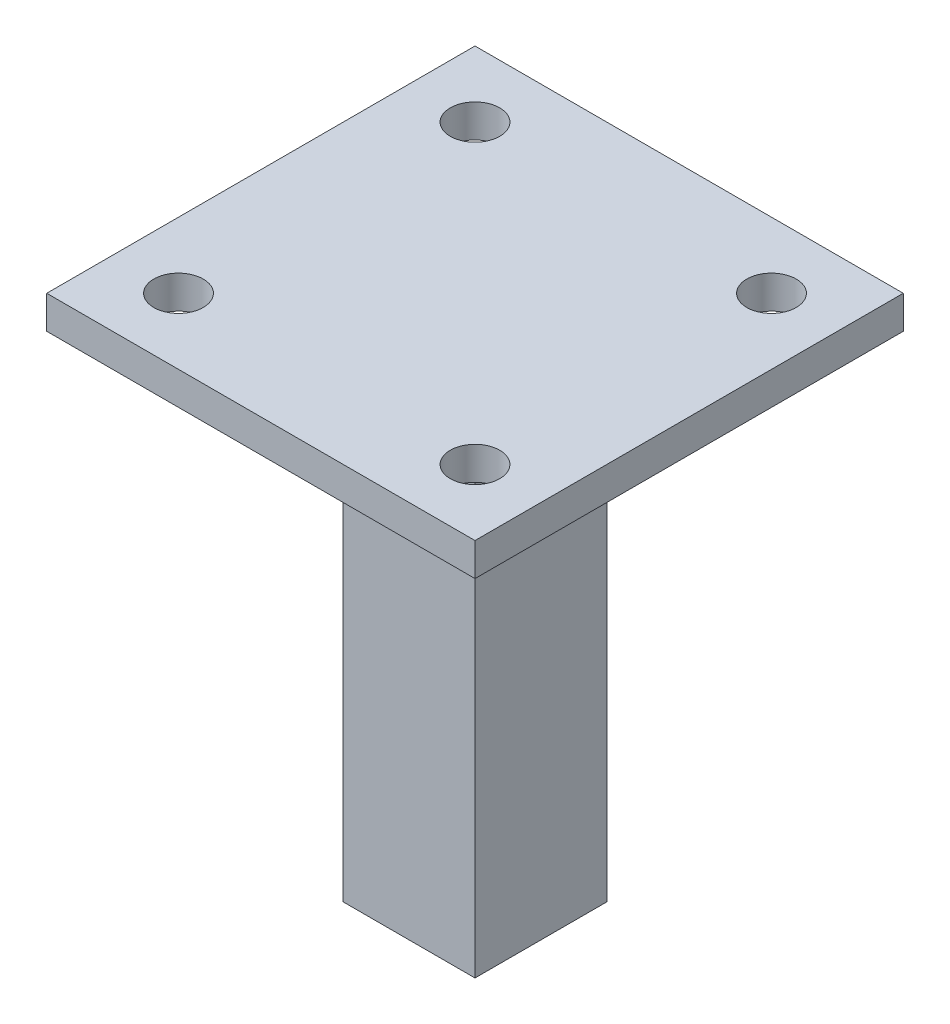
ISO-10303-21;
HEADER;
FILE_DESCRIPTION(('STEP AP214'),'2;1');
FILE_NAME('part.step','',(''),(''),'','','');
FILE_SCHEMA(('AUTOMOTIVE_DESIGN { 1 0 10303 214 1 1 1 1 }'));
ENDSEC;
DATA;
#1=APPLICATION_CONTEXT('core data for automotive mechanical design processes');
#2=APPLICATION_PROTOCOL_DEFINITION('international standard','automotive_design',2000,#1);
#3=PRODUCT_CONTEXT('',#1,'mechanical');
#4=PRODUCT('Part','Part','',(#3));
#5=PRODUCT_RELATED_PRODUCT_CATEGORY('part','',(#4));
#6=PRODUCT_DEFINITION_FORMATION('','',#4);
#7=PRODUCT_DEFINITION_CONTEXT('part definition',#1,'design');
#8=PRODUCT_DEFINITION('design','',#6,#7);
#9=PRODUCT_DEFINITION_SHAPE('','',#8);
#10=(LENGTH_UNIT() NAMED_UNIT(*) SI_UNIT(.MILLI.,.METRE.));
#11=(NAMED_UNIT(*) PLANE_ANGLE_UNIT() SI_UNIT($,.RADIAN.));
#12=(NAMED_UNIT(*) SI_UNIT($,.STERADIAN.) SOLID_ANGLE_UNIT());
#13=UNCERTAINTY_MEASURE_WITH_UNIT(LENGTH_MEASURE(1.E-05),#10,'distance_accuracy_value','');
#14=(GEOMETRIC_REPRESENTATION_CONTEXT(3) GLOBAL_UNCERTAINTY_ASSIGNED_CONTEXT((#13)) GLOBAL_UNIT_ASSIGNED_CONTEXT((#10,
#11,#12)) REPRESENTATION_CONTEXT('',''));
#15=CARTESIAN_POINT('',(0.,0.,0.));
#16=DIRECTION('',(0.,0.,1.));
#17=DIRECTION('',(1.,0.,0.));
#18=AXIS2_PLACEMENT_3D('',#15,#16,#17);
#19=CARTESIAN_POINT('',(20.,150.,20.));
#20=DIRECTION('',(-1.,0.,0.));
#21=DIRECTION('',(0.,0.,1.));
#22=AXIS2_PLACEMENT_3D('',#19,#20,#21);
#23=PLANE('',#22);
#24=DIRECTION('',(0.,0.,-1.));
#25=VECTOR('',#24,1.);
#26=CARTESIAN_POINT('',(20.,0.,20.));
#27=LINE('',#26,#25);
#28=CARTESIAN_POINT('',(20.,0.,20.));
#29=VERTEX_POINT('',#28);
#30=CARTESIAN_POINT('',(20.,0.,-20.));
#31=VERTEX_POINT('',#30);
#32=EDGE_CURVE('E135',#29,#31,#27,.T.);
#33=ORIENTED_EDGE('',*,*,#32,.T.);
#34=DIRECTION('',(0.,-1.,0.));
#35=VECTOR('',#34,1.);
#36=CARTESIAN_POINT('',(20.,150.,-20.));
#37=LINE('',#36,#35);
#38=CARTESIAN_POINT('',(20.,150.,-20.));
#39=VERTEX_POINT('',#38);
#40=EDGE_CURVE('E11',#39,#31,#37,.T.);
#41=ORIENTED_EDGE('',*,*,#40,.F.);
#42=DIRECTION('',(0.,0.,-1.));
#43=VECTOR('',#42,1.);
#44=CARTESIAN_POINT('',(20.,150.,20.));
#45=LINE('',#44,#43);
#46=CARTESIAN_POINT('',(20.,150.,20.));
#47=VERTEX_POINT('',#46);
#48=EDGE_CURVE('E144',#47,#39,#45,.T.);
#49=ORIENTED_EDGE('',*,*,#48,.F.);
#50=DIRECTION('',(0.,-1.,0.));
#51=VECTOR('',#50,1.);
#52=CARTESIAN_POINT('',(20.,150.,20.));
#53=LINE('',#52,#51);
#54=EDGE_CURVE('E153',#47,#29,#53,.T.);
#55=ORIENTED_EDGE('',*,*,#54,.T.);
#56=EDGE_LOOP('',(#33,#41,#49,#55));
#57=FACE_BOUND('',#56,.T.);
#58=ADVANCED_FACE('F36',(#57),#23,.F.);
#59=CARTESIAN_POINT('',(-20.,150.,-20.));
#60=DIRECTION('',(0.,0.,1.));
#61=DIRECTION('',(1.,0.,0.));
#62=AXIS2_PLACEMENT_3D('',#59,#60,#61);
#63=PLANE('',#62);
#64=DIRECTION('',(-1.,0.,0.));
#65=VECTOR('',#64,1.);
#66=CARTESIAN_POINT('',(-20.,0.,-20.));
#67=LINE('',#66,#65);
#68=CARTESIAN_POINT('',(-20.,0.,-20.));
#69=VERTEX_POINT('',#68);
#70=EDGE_CURVE('E138',#31,#69,#67,.T.);
#71=ORIENTED_EDGE('',*,*,#70,.T.);
#72=DIRECTION('',(0.,-1.,0.));
#73=VECTOR('',#72,1.);
#74=CARTESIAN_POINT('',(-20.,150.,-20.));
#75=LINE('',#74,#73);
#76=CARTESIAN_POINT('',(-20.,150.,-20.));
#77=VERTEX_POINT('',#76);
#78=EDGE_CURVE('E44',#77,#69,#75,.T.);
#79=ORIENTED_EDGE('',*,*,#78,.F.);
#80=DIRECTION('',(-1.,0.,0.));
#81=VECTOR('',#80,1.);
#82=CARTESIAN_POINT('',(-20.,150.,-20.));
#83=LINE('',#82,#81);
#84=EDGE_CURVE('E78',#39,#77,#83,.T.);
#85=ORIENTED_EDGE('',*,*,#84,.F.);
#86=ORIENTED_EDGE('',*,*,#40,.T.);
#87=EDGE_LOOP('',(#71,#79,#85,#86));
#88=FACE_BOUND('',#87,.T.);
#89=ADVANCED_FACE('F231',(#88),#63,.F.);
#90=CARTESIAN_POINT('',(-20.,150.,20.));
#91=DIRECTION('',(1.,0.,0.));
#92=DIRECTION('',(0.,0.,-1.));
#93=AXIS2_PLACEMENT_3D('',#90,#91,#92);
#94=PLANE('',#93);
#95=DIRECTION('',(0.,0.,1.));
#96=VECTOR('',#95,1.);
#97=CARTESIAN_POINT('',(-20.,0.,20.));
#98=LINE('',#97,#96);
#99=CARTESIAN_POINT('',(-20.,0.,20.));
#100=VERTEX_POINT('',#99);
#101=EDGE_CURVE('E68',#69,#100,#98,.T.);
#102=ORIENTED_EDGE('',*,*,#101,.T.);
#103=DIRECTION('',(0.,-1.,0.));
#104=VECTOR('',#103,1.);
#105=CARTESIAN_POINT('',(-20.,150.,20.));
#106=LINE('',#105,#104);
#107=CARTESIAN_POINT('',(-20.,150.,20.));
#108=VERTEX_POINT('',#107);
#109=EDGE_CURVE('E52',#108,#100,#106,.T.);
#110=ORIENTED_EDGE('',*,*,#109,.F.);
#111=DIRECTION('',(0.,0.,1.));
#112=VECTOR('',#111,1.);
#113=CARTESIAN_POINT('',(-20.,150.,20.));
#114=LINE('',#113,#112);
#115=EDGE_CURVE('E148',#77,#108,#114,.T.);
#116=ORIENTED_EDGE('',*,*,#115,.F.);
#117=ORIENTED_EDGE('',*,*,#78,.T.);
#118=EDGE_LOOP('',(#102,#110,#116,#117));
#119=FACE_BOUND('',#118,.T.);
#120=ADVANCED_FACE('F159',(#119),#94,.F.);
#121=CARTESIAN_POINT('',(-20.,150.,20.));
#122=DIRECTION('',(0.,0.,-1.));
#123=DIRECTION('',(-1.,0.,0.));
#124=AXIS2_PLACEMENT_3D('',#121,#122,#123);
#125=PLANE('',#124);
#126=DIRECTION('',(1.,0.,0.));
#127=VECTOR('',#126,1.);
#128=CARTESIAN_POINT('',(-20.,0.,20.));
#129=LINE('',#128,#127);
#130=EDGE_CURVE('E73',#100,#29,#129,.T.);
#131=ORIENTED_EDGE('',*,*,#130,.T.);
#132=ORIENTED_EDGE('',*,*,#54,.F.);
#133=DIRECTION('',(1.,0.,0.));
#134=VECTOR('',#133,1.);
#135=CARTESIAN_POINT('',(-20.,150.,20.));
#136=LINE('',#135,#134);
#137=EDGE_CURVE('E151',#108,#47,#136,.T.);
#138=ORIENTED_EDGE('',*,*,#137,.F.);
#139=ORIENTED_EDGE('',*,*,#109,.T.);
#140=EDGE_LOOP('',(#131,#132,#138,#139));
#141=FACE_BOUND('',#140,.T.);
#142=ADVANCED_FACE('F164',(#141),#125,.F.);
#143=CARTESIAN_POINT('',(0.,0.,0.));
#144=DIRECTION('',(0.,-1.,0.));
#145=DIRECTION('',(0.,0.,-1.));
#146=AXIS2_PLACEMENT_3D('',#143,#144,#145);
#147=PLANE('',#146);
#148=ORIENTED_EDGE('',*,*,#32,.F.);
#149=ORIENTED_EDGE('',*,*,#130,.F.);
#150=ORIENTED_EDGE('',*,*,#101,.F.);
#151=ORIENTED_EDGE('',*,*,#70,.F.);
#152=EDGE_LOOP('',(#148,#149,#150,#151));
#153=FACE_BOUND('',#152,.T.);
#154=ADVANCED_FACE('F162',(#153),#147,.T.);
#155=CARTESIAN_POINT('',(0.,160.,0.));
#156=DIRECTION('',(0.,-1.,0.));
#157=DIRECTION('',(0.,0.,-1.));
#158=AXIS2_PLACEMENT_3D('',#155,#156,#157);
#159=PLANE('',#158);
#160=DIRECTION('',(0.,0.,-1.));
#161=VECTOR('',#160,1.);
#162=CARTESIAN_POINT('',(65.,160.,65.));
#163=LINE('',#162,#161);
#164=CARTESIAN_POINT('',(65.,160.,65.));
#165=VERTEX_POINT('',#164);
#166=CARTESIAN_POINT('',(65.,160.,-65.));
#167=VERTEX_POINT('',#166);
#168=EDGE_CURVE('E120',#165,#167,#163,.T.);
#169=ORIENTED_EDGE('',*,*,#168,.T.);
#170=DIRECTION('',(-1.,0.,0.));
#171=VECTOR('',#170,1.);
#172=CARTESIAN_POINT('',(-64.9999999999999,160.,-65.));
#173=LINE('',#172,#171);
#174=CARTESIAN_POINT('',(-64.9999999999999,160.,-65.));
#175=VERTEX_POINT('',#174);
#176=EDGE_CURVE('E109',#167,#175,#173,.T.);
#177=ORIENTED_EDGE('',*,*,#176,.T.);
#178=DIRECTION('',(0.,0.,1.));
#179=VECTOR('',#178,1.);
#180=CARTESIAN_POINT('',(-64.9999999999999,160.,65.));
#181=LINE('',#180,#179);
#182=CARTESIAN_POINT('',(-64.9999999999999,160.,65.));
#183=VERTEX_POINT('',#182);
#184=EDGE_CURVE('E119',#175,#183,#181,.T.);
#185=ORIENTED_EDGE('',*,*,#184,.T.);
#186=DIRECTION('',(1.,0.,0.));
#187=VECTOR('',#186,1.);
#188=CARTESIAN_POINT('',(-64.9999999999999,160.,65.));
#189=LINE('',#188,#187);
#190=EDGE_CURVE('E126',#183,#165,#189,.T.);
#191=ORIENTED_EDGE('',*,*,#190,.T.);
#192=EDGE_LOOP('',(#169,#177,#185,#191));
#193=FACE_BOUND('',#192,.T.);
#194=CARTESIAN_POINT('',(-45.0000000000002,160.,45.0000000000002));
#195=DIRECTION('',(0.,1.,0.));
#196=DIRECTION('',(0.,0.,1.));
#197=AXIS2_PLACEMENT_3D('',#194,#195,#196);
#198=CIRCLE('',#197,7.5);
#199=CARTESIAN_POINT('',(-45.0000000000002,160.,52.5000000000002));
#200=VERTEX_POINT('',#199);
#201=EDGE_CURVE('E201',#200,#200,#198,.T.);
#202=ORIENTED_EDGE('',*,*,#201,.F.);
#203=EDGE_LOOP('',(#202));
#204=FACE_BOUND('',#203,.T.);
#205=CARTESIAN_POINT('',(45.0000000000002,160.,45.0000000000002));
#206=DIRECTION('',(0.,1.,0.));
#207=DIRECTION('',(0.,0.,1.));
#208=AXIS2_PLACEMENT_3D('',#205,#206,#207);
#209=CIRCLE('',#208,7.5);
#210=CARTESIAN_POINT('',(45.0000000000002,160.,52.5000000000002));
#211=VERTEX_POINT('',#210);
#212=EDGE_CURVE('E197',#211,#211,#209,.T.);
#213=ORIENTED_EDGE('',*,*,#212,.F.);
#214=EDGE_LOOP('',(#213));
#215=FACE_BOUND('',#214,.T.);
#216=CARTESIAN_POINT('',(45.0000000000002,160.,-45.0000000000001));
#217=DIRECTION('',(0.,1.,0.));
#218=DIRECTION('',(0.,0.,1.));
#219=AXIS2_PLACEMENT_3D('',#216,#217,#218);
#220=CIRCLE('',#219,7.5);
#221=CARTESIAN_POINT('',(45.0000000000002,160.,-37.5000000000001));
#222=VERTEX_POINT('',#221);
#223=EDGE_CURVE('E193',#222,#222,#220,.T.);
#224=ORIENTED_EDGE('',*,*,#223,.F.);
#225=EDGE_LOOP('',(#224));
#226=FACE_BOUND('',#225,.T.);
#227=CARTESIAN_POINT('',(-44.9999999999999,160.,-45.0000000000001));
#228=DIRECTION('',(0.,1.,0.));
#229=DIRECTION('',(0.,0.,1.));
#230=AXIS2_PLACEMENT_3D('',#227,#228,#229);
#231=CIRCLE('',#230,7.5);
#232=CARTESIAN_POINT('',(-44.9999999999999,160.,-37.5000000000001));
#233=VERTEX_POINT('',#232);
#234=EDGE_CURVE('E188',#233,#233,#231,.T.);
#235=ORIENTED_EDGE('',*,*,#234,.F.);
#236=EDGE_LOOP('',(#235));
#237=FACE_BOUND('',#236,.T.);
#238=ADVANCED_FACE('F123',(#193,#204,#215,#226,#237),#159,.F.);
#239=CARTESIAN_POINT('',(0.,150.,0.));
#240=DIRECTION('',(0.,-1.,0.));
#241=DIRECTION('',(0.,0.,-1.));
#242=AXIS2_PLACEMENT_3D('',#239,#240,#241);
#243=PLANE('',#242);
#244=ORIENTED_EDGE('',*,*,#137,.T.);
#245=ORIENTED_EDGE('',*,*,#48,.T.);
#246=ORIENTED_EDGE('',*,*,#84,.T.);
#247=ORIENTED_EDGE('',*,*,#115,.T.);
#248=EDGE_LOOP('',(#244,#245,#246,#247));
#249=FACE_BOUND('',#248,.T.);
#250=CARTESIAN_POINT('',(45.0000000000002,150.,-45.0000000000001));
#251=DIRECTION('',(0.,1.,0.));
#252=DIRECTION('',(0.,0.,1.));
#253=AXIS2_PLACEMENT_3D('',#250,#251,#252);
#254=CIRCLE('',#253,7.5);
#255=CARTESIAN_POINT('',(45.0000000000002,150.,-37.5000000000001));
#256=VERTEX_POINT('',#255);
#257=EDGE_CURVE('E173',#256,#256,#254,.T.);
#258=ORIENTED_EDGE('',*,*,#257,.T.);
#259=EDGE_LOOP('',(#258));
#260=FACE_BOUND('',#259,.T.);
#261=CARTESIAN_POINT('',(-45.0000000000002,150.,45.0000000000002));
#262=DIRECTION('',(0.,1.,0.));
#263=DIRECTION('',(0.,0.,1.));
#264=AXIS2_PLACEMENT_3D('',#261,#262,#263);
#265=CIRCLE('',#264,7.5);
#266=CARTESIAN_POINT('',(-45.0000000000002,150.,52.5000000000002));
#267=VERTEX_POINT('',#266);
#268=EDGE_CURVE('E177',#267,#267,#265,.T.);
#269=ORIENTED_EDGE('',*,*,#268,.T.);
#270=EDGE_LOOP('',(#269));
#271=FACE_BOUND('',#270,.T.);
#272=DIRECTION('',(0.,0.,-1.));
#273=VECTOR('',#272,1.);
#274=CARTESIAN_POINT('',(65.,150.,65.));
#275=LINE('',#274,#273);
#276=CARTESIAN_POINT('',(65.,150.,65.));
#277=VERTEX_POINT('',#276);
#278=CARTESIAN_POINT('',(65.,150.,-65.));
#279=VERTEX_POINT('',#278);
#280=EDGE_CURVE('E134',#277,#279,#275,.T.);
#281=ORIENTED_EDGE('',*,*,#280,.F.);
#282=DIRECTION('',(1.,0.,0.));
#283=VECTOR('',#282,1.);
#284=CARTESIAN_POINT('',(-64.9999999999999,150.,65.));
#285=LINE('',#284,#283);
#286=CARTESIAN_POINT('',(-64.9999999999999,150.,65.));
#287=VERTEX_POINT('',#286);
#288=EDGE_CURVE('E130',#287,#277,#285,.T.);
#289=ORIENTED_EDGE('',*,*,#288,.F.);
#290=DIRECTION('',(0.,0.,1.));
#291=VECTOR('',#290,1.);
#292=CARTESIAN_POINT('',(-64.9999999999999,150.,65.));
#293=LINE('',#292,#291);
#294=CARTESIAN_POINT('',(-64.9999999999999,150.,-65.));
#295=VERTEX_POINT('',#294);
#296=EDGE_CURVE('E211',#295,#287,#293,.T.);
#297=ORIENTED_EDGE('',*,*,#296,.F.);
#298=DIRECTION('',(-1.,0.,0.));
#299=VECTOR('',#298,1.);
#300=CARTESIAN_POINT('',(-64.9999999999999,150.,-65.));
#301=LINE('',#300,#299);
#302=EDGE_CURVE('E209',#279,#295,#301,.T.);
#303=ORIENTED_EDGE('',*,*,#302,.F.);
#304=EDGE_LOOP('',(#281,#289,#297,#303));
#305=FACE_BOUND('',#304,.T.);
#306=CARTESIAN_POINT('',(45.0000000000002,150.,45.0000000000002));
#307=DIRECTION('',(0.,1.,0.));
#308=DIRECTION('',(0.,0.,1.));
#309=AXIS2_PLACEMENT_3D('',#306,#307,#308);
#310=CIRCLE('',#309,7.5);
#311=CARTESIAN_POINT('',(45.0000000000002,150.,52.5000000000002));
#312=VERTEX_POINT('',#311);
#313=EDGE_CURVE('E183',#312,#312,#310,.T.);
#314=ORIENTED_EDGE('',*,*,#313,.T.);
#315=EDGE_LOOP('',(#314));
#316=FACE_BOUND('',#315,.T.);
#317=CARTESIAN_POINT('',(-44.9999999999999,150.,-45.0000000000001));
#318=DIRECTION('',(0.,1.,0.));
#319=DIRECTION('',(0.,0.,1.));
#320=AXIS2_PLACEMENT_3D('',#317,#318,#319);
#321=CIRCLE('',#320,7.5);
#322=CARTESIAN_POINT('',(-44.9999999999999,150.,-37.5000000000001));
#323=VERTEX_POINT('',#322);
#324=EDGE_CURVE('E186',#323,#323,#321,.T.);
#325=ORIENTED_EDGE('',*,*,#324,.T.);
#326=EDGE_LOOP('',(#325));
#327=FACE_BOUND('',#326,.T.);
#328=ADVANCED_FACE('F166',(#249,#260,#271,#305,#316,#327),#243,.T.);
#329=CARTESIAN_POINT('',(65.,160.,65.));
#330=DIRECTION('',(-1.,0.,0.));
#331=DIRECTION('',(0.,0.,1.));
#332=AXIS2_PLACEMENT_3D('',#329,#330,#331);
#333=PLANE('',#332);
#334=ORIENTED_EDGE('',*,*,#280,.T.);
#335=DIRECTION('',(0.,-1.,0.));
#336=VECTOR('',#335,1.);
#337=CARTESIAN_POINT('',(65.,160.,-65.));
#338=LINE('',#337,#336);
#339=EDGE_CURVE('E113',#167,#279,#338,.T.);
#340=ORIENTED_EDGE('',*,*,#339,.F.);
#341=ORIENTED_EDGE('',*,*,#168,.F.);
#342=DIRECTION('',(0.,-1.,0.));
#343=VECTOR('',#342,1.);
#344=CARTESIAN_POINT('',(65.,160.,65.));
#345=LINE('',#344,#343);
#346=EDGE_CURVE('E207',#165,#277,#345,.T.);
#347=ORIENTED_EDGE('',*,*,#346,.T.);
#348=EDGE_LOOP('',(#334,#340,#341,#347));
#349=FACE_BOUND('',#348,.T.);
#350=ADVANCED_FACE('F132',(#349),#333,.F.);
#351=CARTESIAN_POINT('',(-64.9999999999999,160.,-65.));
#352=DIRECTION('',(0.,0.,1.));
#353=DIRECTION('',(1.,0.,0.));
#354=AXIS2_PLACEMENT_3D('',#351,#352,#353);
#355=PLANE('',#354);
#356=ORIENTED_EDGE('',*,*,#302,.T.);
#357=DIRECTION('',(0.,-1.,0.));
#358=VECTOR('',#357,1.);
#359=CARTESIAN_POINT('',(-64.9999999999999,160.,-65.));
#360=LINE('',#359,#358);
#361=EDGE_CURVE('E116',#175,#295,#360,.T.);
#362=ORIENTED_EDGE('',*,*,#361,.F.);
#363=ORIENTED_EDGE('',*,*,#176,.F.);
#364=ORIENTED_EDGE('',*,*,#339,.T.);
#365=EDGE_LOOP('',(#356,#362,#363,#364));
#366=FACE_BOUND('',#365,.T.);
#367=ADVANCED_FACE('F111',(#366),#355,.F.);
#368=CARTESIAN_POINT('',(-64.9999999999999,160.,65.));
#369=DIRECTION('',(1.,0.,0.));
#370=DIRECTION('',(0.,0.,-1.));
#371=AXIS2_PLACEMENT_3D('',#368,#369,#370);
#372=PLANE('',#371);
#373=ORIENTED_EDGE('',*,*,#296,.T.);
#374=DIRECTION('',(0.,-1.,0.));
#375=VECTOR('',#374,1.);
#376=CARTESIAN_POINT('',(-64.9999999999999,160.,65.));
#377=LINE('',#376,#375);
#378=EDGE_CURVE('E140',#183,#287,#377,.T.);
#379=ORIENTED_EDGE('',*,*,#378,.F.);
#380=ORIENTED_EDGE('',*,*,#184,.F.);
#381=ORIENTED_EDGE('',*,*,#361,.T.);
#382=EDGE_LOOP('',(#373,#379,#380,#381));
#383=FACE_BOUND('',#382,.T.);
#384=ADVANCED_FACE('F220',(#383),#372,.F.);
#385=CARTESIAN_POINT('',(-64.9999999999999,160.,65.));
#386=DIRECTION('',(0.,0.,-1.));
#387=DIRECTION('',(-1.,0.,0.));
#388=AXIS2_PLACEMENT_3D('',#385,#386,#387);
#389=PLANE('',#388);
#390=ORIENTED_EDGE('',*,*,#288,.T.);
#391=ORIENTED_EDGE('',*,*,#346,.F.);
#392=ORIENTED_EDGE('',*,*,#190,.F.);
#393=ORIENTED_EDGE('',*,*,#378,.T.);
#394=EDGE_LOOP('',(#390,#391,#392,#393));
#395=FACE_BOUND('',#394,.T.);
#396=ADVANCED_FACE('F217',(#395),#389,.F.);
#397=CARTESIAN_POINT('',(-45.0000000000002,160.,45.0000000000002));
#398=DIRECTION('',(0.,-1.,0.));
#399=DIRECTION('',(0.,0.,-1.));
#400=AXIS2_PLACEMENT_3D('',#397,#398,#399);
#401=CYLINDRICAL_SURFACE('',#400,7.5);
#402=ORIENTED_EDGE('',*,*,#201,.T.);
#403=EDGE_LOOP('',(#402));
#404=FACE_BOUND('',#403,.T.);
#405=ORIENTED_EDGE('',*,*,#268,.F.);
#406=EDGE_LOOP('',(#405));
#407=FACE_BOUND('',#406,.T.);
#408=ADVANCED_FACE('F227',(#404,#407),#401,.F.);
#409=CARTESIAN_POINT('',(45.0000000000002,160.,45.0000000000002));
#410=DIRECTION('',(0.,-1.,0.));
#411=DIRECTION('',(0.,0.,-1.));
#412=AXIS2_PLACEMENT_3D('',#409,#410,#411);
#413=CYLINDRICAL_SURFACE('',#412,7.5);
#414=ORIENTED_EDGE('',*,*,#212,.T.);
#415=EDGE_LOOP('',(#414));
#416=FACE_BOUND('',#415,.T.);
#417=ORIENTED_EDGE('',*,*,#313,.F.);
#418=EDGE_LOOP('',(#417));
#419=FACE_BOUND('',#418,.T.);
#420=ADVANCED_FACE('F273',(#416,#419),#413,.F.);
#421=CARTESIAN_POINT('',(45.0000000000002,160.,-45.0000000000001));
#422=DIRECTION('',(0.,-1.,0.));
#423=DIRECTION('',(0.,0.,-1.));
#424=AXIS2_PLACEMENT_3D('',#421,#422,#423);
#425=CYLINDRICAL_SURFACE('',#424,7.5);
#426=ORIENTED_EDGE('',*,*,#223,.T.);
#427=EDGE_LOOP('',(#426));
#428=FACE_BOUND('',#427,.T.);
#429=ORIENTED_EDGE('',*,*,#257,.F.);
#430=EDGE_LOOP('',(#429));
#431=FACE_BOUND('',#430,.T.);
#432=ADVANCED_FACE('F283',(#428,#431),#425,.F.);
#433=CARTESIAN_POINT('',(-44.9999999999999,160.,-45.0000000000001));
#434=DIRECTION('',(0.,-1.,0.));
#435=DIRECTION('',(0.,0.,-1.));
#436=AXIS2_PLACEMENT_3D('',#433,#434,#435);
#437=CYLINDRICAL_SURFACE('',#436,7.5);
#438=ORIENTED_EDGE('',*,*,#234,.T.);
#439=EDGE_LOOP('',(#438));
#440=FACE_BOUND('',#439,.T.);
#441=ORIENTED_EDGE('',*,*,#324,.F.);
#442=EDGE_LOOP('',(#441));
#443=FACE_BOUND('',#442,.T.);
#444=ADVANCED_FACE('F293',(#440,#443),#437,.F.);
#445=CLOSED_SHELL('',(#58,#89,#120,#142,#154,#238,#328,#350,#367,#384,#396,#408,#420,#432,#444));
#446=MANIFOLD_SOLID_BREP('B2',#445);
#447=ADVANCED_BREP_SHAPE_REPRESENTATION('',(#18,#446),#14);
#448=SHAPE_DEFINITION_REPRESENTATION(#9,#447);
ENDSEC;
END-ISO-10303-21;
